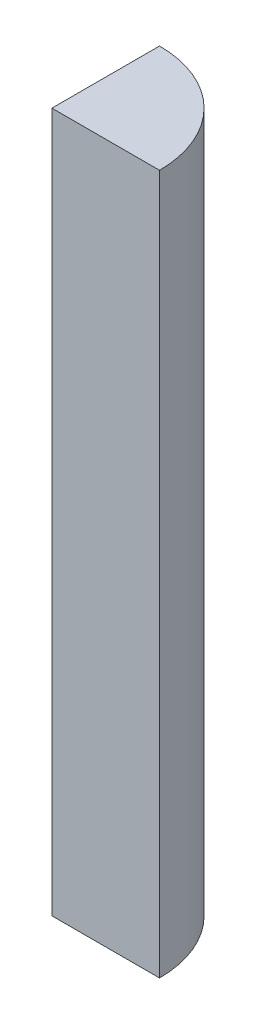
ISO-10303-21;
HEADER;
FILE_DESCRIPTION(('STEP AP214'),'2;1');
FILE_NAME('part.step','',(''),(''),'','','');
FILE_SCHEMA(('AUTOMOTIVE_DESIGN { 1 0 10303 214 1 1 1 1 }'));
ENDSEC;
DATA;
#1=APPLICATION_CONTEXT('core data for automotive mechanical design processes');
#2=APPLICATION_PROTOCOL_DEFINITION('international standard','automotive_design',2000,#1);
#3=PRODUCT_CONTEXT('',#1,'mechanical');
#4=PRODUCT('Part','Part','',(#3));
#5=PRODUCT_RELATED_PRODUCT_CATEGORY('part','',(#4));
#6=PRODUCT_DEFINITION_FORMATION('','',#4);
#7=PRODUCT_DEFINITION_CONTEXT('part definition',#1,'design');
#8=PRODUCT_DEFINITION('design','',#6,#7);
#9=PRODUCT_DEFINITION_SHAPE('','',#8);
#10=(LENGTH_UNIT() NAMED_UNIT(*) SI_UNIT(.MILLI.,.METRE.));
#11=(NAMED_UNIT(*) PLANE_ANGLE_UNIT() SI_UNIT($,.RADIAN.));
#12=(NAMED_UNIT(*) SI_UNIT($,.STERADIAN.) SOLID_ANGLE_UNIT());
#13=UNCERTAINTY_MEASURE_WITH_UNIT(LENGTH_MEASURE(1.E-05),#10,'distance_accuracy_value','');
#14=(GEOMETRIC_REPRESENTATION_CONTEXT(3) GLOBAL_UNCERTAINTY_ASSIGNED_CONTEXT((#13)) GLOBAL_UNIT_ASSIGNED_CONTEXT((#10,
#11,#12)) REPRESENTATION_CONTEXT('',''));
#15=CARTESIAN_POINT('',(0.,0.,0.));
#16=DIRECTION('',(0.,0.,1.));
#17=DIRECTION('',(1.,0.,0.));
#18=AXIS2_PLACEMENT_3D('',#15,#16,#17);
#19=CARTESIAN_POINT('',(0.,130.,0.));
#20=DIRECTION('',(1.,0.,0.));
#21=DIRECTION('',(0.,0.,-1.));
#22=AXIS2_PLACEMENT_3D('',#19,#20,#21);
#23=PLANE('',#22);
#24=DIRECTION('',(0.,0.,1.));
#25=VECTOR('',#24,1.);
#26=CARTESIAN_POINT('',(0.,0.,0.));
#27=LINE('',#26,#25);
#28=CARTESIAN_POINT('',(0.,0.,-20.));
#29=VERTEX_POINT('',#28);
#30=CARTESIAN_POINT('',(0.,0.,0.));
#31=VERTEX_POINT('',#30);
#32=EDGE_CURVE('E89',#29,#31,#27,.T.);
#33=ORIENTED_EDGE('',*,*,#32,.T.);
#34=DIRECTION('',(0.,-1.,0.));
#35=VECTOR('',#34,1.);
#36=CARTESIAN_POINT('',(0.,130.,0.));
#37=LINE('',#36,#35);
#38=CARTESIAN_POINT('',(0.,130.,0.));
#39=VERTEX_POINT('',#38);
#40=EDGE_CURVE('E11',#39,#31,#37,.T.);
#41=ORIENTED_EDGE('',*,*,#40,.F.);
#42=DIRECTION('',(0.,0.,1.));
#43=VECTOR('',#42,1.);
#44=CARTESIAN_POINT('',(0.,130.,0.));
#45=LINE('',#44,#43);
#46=CARTESIAN_POINT('',(0.,130.,-20.));
#47=VERTEX_POINT('',#46);
#48=EDGE_CURVE('E81',#47,#39,#45,.T.);
#49=ORIENTED_EDGE('',*,*,#48,.F.);
#50=DIRECTION('',(0.,-1.,0.));
#51=VECTOR('',#50,1.);
#52=CARTESIAN_POINT('',(0.,130.,-20.));
#53=LINE('',#52,#51);
#54=EDGE_CURVE('E90',#47,#29,#53,.T.);
#55=ORIENTED_EDGE('',*,*,#54,.T.);
#56=EDGE_LOOP('',(#33,#41,#49,#55));
#57=FACE_BOUND('',#56,.T.);
#58=ADVANCED_FACE('F39',(#57),#23,.F.);
#59=CARTESIAN_POINT('',(0.,130.,0.));
#60=DIRECTION('',(0.,0.,-1.));
#61=DIRECTION('',(-1.,0.,0.));
#62=AXIS2_PLACEMENT_3D('',#59,#60,#61);
#63=PLANE('',#62);
#64=DIRECTION('',(1.,0.,0.));
#65=VECTOR('',#64,1.);
#66=CARTESIAN_POINT('',(0.,0.,0.));
#67=LINE('',#66,#65);
#68=CARTESIAN_POINT('',(20.,0.,0.));
#69=VERTEX_POINT('',#68);
#70=EDGE_CURVE('E68',#31,#69,#67,.T.);
#71=ORIENTED_EDGE('',*,*,#70,.T.);
#72=DIRECTION('',(0.,-1.,0.));
#73=VECTOR('',#72,1.);
#74=CARTESIAN_POINT('',(20.,130.,0.));
#75=LINE('',#74,#73);
#76=CARTESIAN_POINT('',(20.,130.,0.));
#77=VERTEX_POINT('',#76);
#78=EDGE_CURVE('E48',#77,#69,#75,.T.);
#79=ORIENTED_EDGE('',*,*,#78,.F.);
#80=DIRECTION('',(1.,0.,0.));
#81=VECTOR('',#80,1.);
#82=CARTESIAN_POINT('',(0.,130.,0.));
#83=LINE('',#82,#81);
#84=EDGE_CURVE('E76',#39,#77,#83,.T.);
#85=ORIENTED_EDGE('',*,*,#84,.F.);
#86=ORIENTED_EDGE('',*,*,#40,.T.);
#87=EDGE_LOOP('',(#71,#79,#85,#86));
#88=FACE_BOUND('',#87,.T.);
#89=ADVANCED_FACE('F77',(#88),#63,.F.);
#90=CARTESIAN_POINT('',(0.,130.,0.));
#91=DIRECTION('',(0.,-1.,0.));
#92=DIRECTION('',(0.,0.,-1.));
#93=AXIS2_PLACEMENT_3D('',#90,#91,#92);
#94=CYLINDRICAL_SURFACE('',#93,20.);
#95=CARTESIAN_POINT('',(0.,0.,0.));
#96=DIRECTION('',(0.,1.,0.));
#97=DIRECTION('',(0.,0.,1.));
#98=AXIS2_PLACEMENT_3D('',#95,#96,#97);
#99=CIRCLE('',#98,20.);
#100=EDGE_CURVE('E73',#69,#29,#99,.T.);
#101=ORIENTED_EDGE('',*,*,#100,.T.);
#102=ORIENTED_EDGE('',*,*,#54,.F.);
#103=CARTESIAN_POINT('',(0.,130.,0.));
#104=DIRECTION('',(0.,1.,0.));
#105=DIRECTION('',(0.,0.,1.));
#106=AXIS2_PLACEMENT_3D('',#103,#104,#105);
#107=CIRCLE('',#106,20.);
#108=EDGE_CURVE('E56',#77,#47,#107,.T.);
#109=ORIENTED_EDGE('',*,*,#108,.F.);
#110=ORIENTED_EDGE('',*,*,#78,.T.);
#111=EDGE_LOOP('',(#101,#102,#109,#110));
#112=FACE_BOUND('',#111,.T.);
#113=ADVANCED_FACE('F102',(#112),#94,.T.);
#114=CARTESIAN_POINT('',(0.,130.,0.));
#115=DIRECTION('',(0.,1.,0.));
#116=DIRECTION('',(0.,0.,1.));
#117=AXIS2_PLACEMENT_3D('',#114,#115,#116);
#118=PLANE('',#117);
#119=ORIENTED_EDGE('',*,*,#48,.T.);
#120=ORIENTED_EDGE('',*,*,#84,.T.);
#121=ORIENTED_EDGE('',*,*,#108,.T.);
#122=EDGE_LOOP('',(#119,#120,#121));
#123=FACE_BOUND('',#122,.T.);
#124=ADVANCED_FACE('F84',(#123),#118,.T.);
#125=CARTESIAN_POINT('',(0.,0.,0.));
#126=DIRECTION('',(0.,1.,0.));
#127=DIRECTION('',(0.,0.,1.));
#128=AXIS2_PLACEMENT_3D('',#125,#126,#127);
#129=PLANE('',#128);
#130=ORIENTED_EDGE('',*,*,#32,.F.);
#131=ORIENTED_EDGE('',*,*,#100,.F.);
#132=ORIENTED_EDGE('',*,*,#70,.F.);
#133=EDGE_LOOP('',(#130,#131,#132));
#134=FACE_BOUND('',#133,.T.);
#135=ADVANCED_FACE('F103',(#134),#129,.F.);
#136=CLOSED_SHELL('',(#58,#89,#113,#124,#135));
#137=MANIFOLD_SOLID_BREP('B2',#136);
#138=ADVANCED_BREP_SHAPE_REPRESENTATION('',(#18,#137),#14);
#139=SHAPE_DEFINITION_REPRESENTATION(#9,#138);
ENDSEC;
END-ISO-10303-21;
